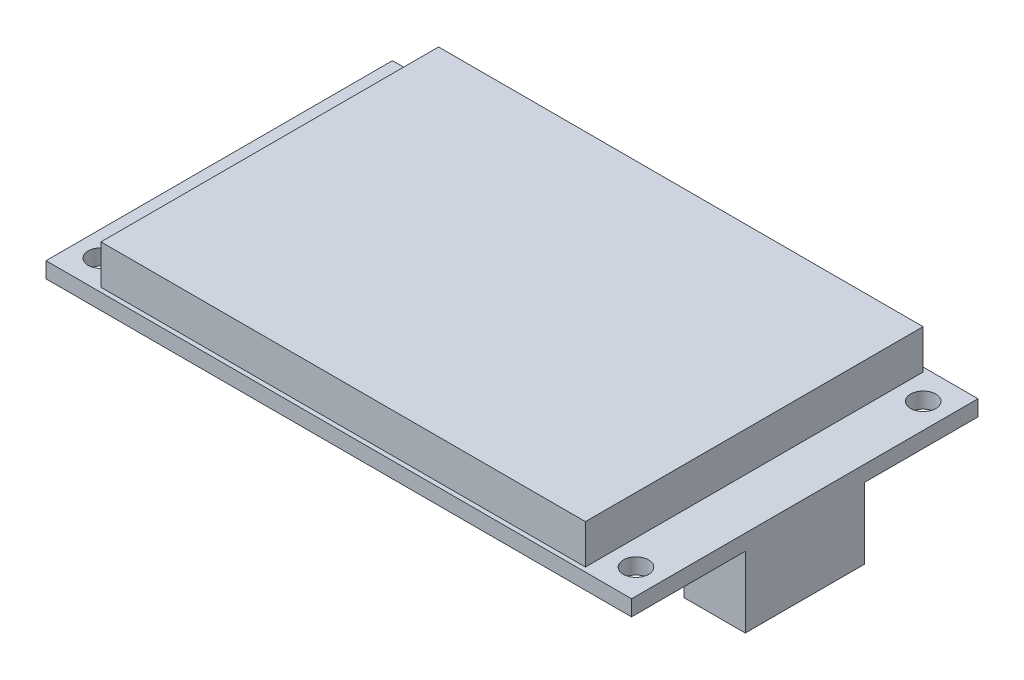
ISO-10303-21;
HEADER;
FILE_DESCRIPTION(('STEP AP214'),'2;1');
FILE_NAME('part.step','',(''),(''),'','','');
FILE_SCHEMA(('AUTOMOTIVE_DESIGN { 1 0 10303 214 1 1 1 1 }'));
ENDSEC;
DATA;
#1=APPLICATION_CONTEXT('core data for automotive mechanical design processes');
#2=APPLICATION_PROTOCOL_DEFINITION('international standard','automotive_design',2000,#1);
#3=PRODUCT_CONTEXT('',#1,'mechanical');
#4=PRODUCT('Part','Part','',(#3));
#5=PRODUCT_RELATED_PRODUCT_CATEGORY('part','',(#4));
#6=PRODUCT_DEFINITION_FORMATION('','',#4);
#7=PRODUCT_DEFINITION_CONTEXT('part definition',#1,'design');
#8=PRODUCT_DEFINITION('design','',#6,#7);
#9=PRODUCT_DEFINITION_SHAPE('','',#8);
#10=(LENGTH_UNIT() NAMED_UNIT(*) SI_UNIT(.MILLI.,.METRE.));
#11=(NAMED_UNIT(*) PLANE_ANGLE_UNIT() SI_UNIT($,.RADIAN.));
#12=(NAMED_UNIT(*) SI_UNIT($,.STERADIAN.) SOLID_ANGLE_UNIT());
#13=UNCERTAINTY_MEASURE_WITH_UNIT(LENGTH_MEASURE(1.E-05),#10,'distance_accuracy_value','');
#14=(GEOMETRIC_REPRESENTATION_CONTEXT(3) GLOBAL_UNCERTAINTY_ASSIGNED_CONTEXT((#13)) GLOBAL_UNIT_ASSIGNED_CONTEXT((#10,
#11,#12)) REPRESENTATION_CONTEXT('',''));
#15=CARTESIAN_POINT('',(0.,0.,0.));
#16=DIRECTION('',(0.,0.,1.));
#17=DIRECTION('',(1.,0.,0.));
#18=AXIS2_PLACEMENT_3D('',#15,#16,#17);
#19=CARTESIAN_POINT('',(0.,2.,0.));
#20=DIRECTION('',(0.,-1.,0.));
#21=DIRECTION('',(0.,0.,-1.));
#22=AXIS2_PLACEMENT_3D('',#19,#20,#21);
#23=PLANE('',#22);
#24=CARTESIAN_POINT('',(-34.,2.,18.25));
#25=DIRECTION('',(0.,1.,0.));
#26=DIRECTION('',(0.,0.,-1.));
#27=AXIS2_PLACEMENT_3D('',#24,#25,#26);
#28=CIRCLE('',#27,1.6);
#29=CARTESIAN_POINT('',(-34.,2.,16.65));
#30=VERTEX_POINT('',#29);
#31=EDGE_CURVE('E210',#30,#30,#28,.T.);
#32=ORIENTED_EDGE('',*,*,#31,.F.);
#33=EDGE_LOOP('',(#32));
#34=FACE_BOUND('',#33,.T.);
#35=CARTESIAN_POINT('',(34.,2.,18.25));
#36=DIRECTION('',(0.,1.,0.));
#37=DIRECTION('',(0.,0.,1.));
#38=AXIS2_PLACEMENT_3D('',#35,#36,#37);
#39=CIRCLE('',#38,1.6);
#40=CARTESIAN_POINT('',(34.,2.,19.85));
#41=VERTEX_POINT('',#40);
#42=EDGE_CURVE('E218',#41,#41,#39,.T.);
#43=ORIENTED_EDGE('',*,*,#42,.F.);
#44=EDGE_LOOP('',(#43));
#45=FACE_BOUND('',#44,.T.);
#46=CARTESIAN_POINT('',(34.,2.,-18.25));
#47=DIRECTION('',(0.,1.,0.));
#48=DIRECTION('',(0.,0.,-1.));
#49=AXIS2_PLACEMENT_3D('',#46,#47,#48);
#50=CIRCLE('',#49,1.6);
#51=CARTESIAN_POINT('',(34.,2.,-19.85));
#52=VERTEX_POINT('',#51);
#53=EDGE_CURVE('E226',#52,#52,#50,.T.);
#54=ORIENTED_EDGE('',*,*,#53,.F.);
#55=EDGE_LOOP('',(#54));
#56=FACE_BOUND('',#55,.T.);
#57=CARTESIAN_POINT('',(-34.,2.,-18.25));
#58=DIRECTION('',(0.,1.,0.));
#59=DIRECTION('',(0.,0.,1.));
#60=AXIS2_PLACEMENT_3D('',#57,#58,#59);
#61=CIRCLE('',#60,1.6);
#62=CARTESIAN_POINT('',(-34.,2.,-16.65));
#63=VERTEX_POINT('',#62);
#64=EDGE_CURVE('E234',#63,#63,#61,.T.);
#65=ORIENTED_EDGE('',*,*,#64,.F.);
#66=EDGE_LOOP('',(#65));
#67=FACE_BOUND('',#66,.T.);
#68=DIRECTION('',(0.,0.,-1.));
#69=VECTOR('',#68,1.);
#70=CARTESIAN_POINT('',(37.2,2.,22.01));
#71=LINE('',#70,#69);
#72=CARTESIAN_POINT('',(37.2,2.,22.01));
#73=VERTEX_POINT('',#72);
#74=CARTESIAN_POINT('',(37.2,2.,-22.01));
#75=VERTEX_POINT('',#74);
#76=EDGE_CURVE('E241',#73,#75,#71,.T.);
#77=ORIENTED_EDGE('',*,*,#76,.T.);
#78=DIRECTION('',(-1.,0.,0.));
#79=VECTOR('',#78,1.);
#80=CARTESIAN_POINT('',(-37.2,2.,-22.01));
#81=LINE('',#80,#79);
#82=CARTESIAN_POINT('',(-37.2,2.,-22.01));
#83=VERTEX_POINT('',#82);
#84=EDGE_CURVE('E245',#75,#83,#81,.T.);
#85=ORIENTED_EDGE('',*,*,#84,.T.);
#86=DIRECTION('',(0.,0.,1.));
#87=VECTOR('',#86,1.);
#88=CARTESIAN_POINT('',(-37.2,2.,22.01));
#89=LINE('',#88,#87);
#90=CARTESIAN_POINT('',(-37.2,2.,22.01));
#91=VERTEX_POINT('',#90);
#92=EDGE_CURVE('E249',#83,#91,#89,.T.);
#93=ORIENTED_EDGE('',*,*,#92,.T.);
#94=DIRECTION('',(1.,0.,0.));
#95=VECTOR('',#94,1.);
#96=CARTESIAN_POINT('',(-37.2,2.,22.01));
#97=LINE('',#96,#95);
#98=EDGE_CURVE('E252',#91,#73,#97,.T.);
#99=ORIENTED_EDGE('',*,*,#98,.T.);
#100=EDGE_LOOP('',(#77,#85,#93,#99));
#101=FACE_BOUND('',#100,.T.);
#102=DIRECTION('',(0.,0.,-1.));
#103=VECTOR('',#102,1.);
#104=CARTESIAN_POINT('',(30.78,2.,21.45));
#105=LINE('',#104,#103);
#106=CARTESIAN_POINT('',(30.78,2.,21.45));
#107=VERTEX_POINT('',#106);
#108=CARTESIAN_POINT('',(30.78,2.,-21.45));
#109=VERTEX_POINT('',#108);
#110=EDGE_CURVE('E158',#107,#109,#105,.T.);
#111=ORIENTED_EDGE('',*,*,#110,.F.);
#112=DIRECTION('',(1.,0.,0.));
#113=VECTOR('',#112,1.);
#114=CARTESIAN_POINT('',(-30.78,2.,21.45));
#115=LINE('',#114,#113);
#116=CARTESIAN_POINT('',(-30.78,2.,21.45));
#117=VERTEX_POINT('',#116);
#118=EDGE_CURVE('E174',#117,#107,#115,.T.);
#119=ORIENTED_EDGE('',*,*,#118,.F.);
#120=DIRECTION('',(0.,0.,1.));
#121=VECTOR('',#120,1.);
#122=CARTESIAN_POINT('',(-30.78,2.,21.45));
#123=LINE('',#122,#121);
#124=CARTESIAN_POINT('',(-30.78,2.,-21.45));
#125=VERTEX_POINT('',#124);
#126=EDGE_CURVE('E187',#125,#117,#123,.T.);
#127=ORIENTED_EDGE('',*,*,#126,.F.);
#128=DIRECTION('',(-1.,0.,0.));
#129=VECTOR('',#128,1.);
#130=CARTESIAN_POINT('',(-30.78,2.,-21.45));
#131=LINE('',#130,#129);
#132=EDGE_CURVE('E163',#109,#125,#131,.T.);
#133=ORIENTED_EDGE('',*,*,#132,.F.);
#134=EDGE_LOOP('',(#111,#119,#127,#133));
#135=FACE_BOUND('',#134,.T.);
#136=ADVANCED_FACE('F42',(#34,#45,#56,#67,#101,#135),#23,.F.);
#137=CARTESIAN_POINT('',(0.,0.,0.));
#138=DIRECTION('',(0.,-1.,0.));
#139=DIRECTION('',(0.,0.,-1.));
#140=AXIS2_PLACEMENT_3D('',#137,#138,#139);
#141=PLANE('',#140);
#142=DIRECTION('',(1.,0.,0.));
#143=VECTOR('',#142,1.);
#144=CARTESIAN_POINT('',(29.4,0.,-7.56));
#145=LINE('',#144,#143);
#146=CARTESIAN_POINT('',(29.4,0.,-7.56));
#147=VERTEX_POINT('',#146);
#148=CARTESIAN_POINT('',(37.2,0.,-7.56));
#149=VERTEX_POINT('',#148);
#150=EDGE_CURVE('E58',#147,#149,#145,.T.);
#151=ORIENTED_EDGE('',*,*,#150,.F.);
#152=DIRECTION('',(0.,0.,-1.));
#153=VECTOR('',#152,1.);
#154=CARTESIAN_POINT('',(29.4,0.,-7.56));
#155=LINE('',#154,#153);
#156=CARTESIAN_POINT('',(29.4,0.,7.56));
#157=VERTEX_POINT('',#156);
#158=EDGE_CURVE('E521',#157,#147,#155,.T.);
#159=ORIENTED_EDGE('',*,*,#158,.F.);
#160=DIRECTION('',(-1.,0.,0.));
#161=VECTOR('',#160,1.);
#162=CARTESIAN_POINT('',(29.4,0.,7.56));
#163=LINE('',#162,#161);
#164=CARTESIAN_POINT('',(37.2,0.,7.56));
#165=VERTEX_POINT('',#164);
#166=EDGE_CURVE('E531',#165,#157,#163,.T.);
#167=ORIENTED_EDGE('',*,*,#166,.F.);
#168=DIRECTION('',(0.,0.,-1.));
#169=VECTOR('',#168,1.);
#170=CARTESIAN_POINT('',(37.2,0.,22.01));
#171=LINE('',#170,#169);
#172=CARTESIAN_POINT('',(37.2,0.,22.01));
#173=VERTEX_POINT('',#172);
#174=EDGE_CURVE('E156',#173,#165,#171,.T.);
#175=ORIENTED_EDGE('',*,*,#174,.F.);
#176=DIRECTION('',(1.,0.,0.));
#177=VECTOR('',#176,1.);
#178=CARTESIAN_POINT('',(-37.2,0.,22.01));
#179=LINE('',#178,#177);
#180=CARTESIAN_POINT('',(-37.2,0.,22.01));
#181=VERTEX_POINT('',#180);
#182=EDGE_CURVE('E246',#181,#173,#179,.T.);
#183=ORIENTED_EDGE('',*,*,#182,.F.);
#184=DIRECTION('',(0.,0.,1.));
#185=VECTOR('',#184,1.);
#186=CARTESIAN_POINT('',(-37.2,0.,22.01));
#187=LINE('',#186,#185);
#188=CARTESIAN_POINT('',(-37.2,0.,-22.01));
#189=VERTEX_POINT('',#188);
#190=EDGE_CURVE('E261',#189,#181,#187,.T.);
#191=ORIENTED_EDGE('',*,*,#190,.F.);
#192=DIRECTION('',(-1.,0.,0.));
#193=VECTOR('',#192,1.);
#194=CARTESIAN_POINT('',(-37.2,0.,-22.01));
#195=LINE('',#194,#193);
#196=CARTESIAN_POINT('',(37.2,0.,-22.01));
#197=VERTEX_POINT('',#196);
#198=EDGE_CURVE('E258',#197,#189,#195,.T.);
#199=ORIENTED_EDGE('',*,*,#198,.F.);
#200=EDGE_CURVE('E63',#149,#197,#171,.T.);
#201=ORIENTED_EDGE('',*,*,#200,.F.);
#202=EDGE_LOOP('',(#151,#159,#167,#175,#183,#191,#199,#201));
#203=FACE_BOUND('',#202,.T.);
#204=CARTESIAN_POINT('',(34.,0.,18.25));
#205=DIRECTION('',(0.,1.,0.));
#206=DIRECTION('',(0.,0.,1.));
#207=AXIS2_PLACEMENT_3D('',#204,#205,#206);
#208=CIRCLE('',#207,1.6);
#209=CARTESIAN_POINT('',(34.,0.,19.85));
#210=VERTEX_POINT('',#209);
#211=EDGE_CURVE('E214',#210,#210,#208,.T.);
#212=ORIENTED_EDGE('',*,*,#211,.T.);
#213=EDGE_LOOP('',(#212));
#214=FACE_BOUND('',#213,.T.);
#215=CARTESIAN_POINT('',(-34.,0.,-18.25));
#216=DIRECTION('',(0.,1.,0.));
#217=DIRECTION('',(0.,0.,1.));
#218=AXIS2_PLACEMENT_3D('',#215,#216,#217);
#219=CIRCLE('',#218,1.6);
#220=CARTESIAN_POINT('',(-34.,0.,-16.65));
#221=VERTEX_POINT('',#220);
#222=EDGE_CURVE('E230',#221,#221,#219,.T.);
#223=ORIENTED_EDGE('',*,*,#222,.T.);
#224=EDGE_LOOP('',(#223));
#225=FACE_BOUND('',#224,.T.);
#226=CARTESIAN_POINT('',(34.,0.,-18.25));
#227=DIRECTION('',(0.,1.,0.));
#228=DIRECTION('',(0.,0.,-1.));
#229=AXIS2_PLACEMENT_3D('',#226,#227,#228);
#230=CIRCLE('',#229,1.6);
#231=CARTESIAN_POINT('',(34.,0.,-19.85));
#232=VERTEX_POINT('',#231);
#233=EDGE_CURVE('E222',#232,#232,#230,.T.);
#234=ORIENTED_EDGE('',*,*,#233,.T.);
#235=EDGE_LOOP('',(#234));
#236=FACE_BOUND('',#235,.T.);
#237=CARTESIAN_POINT('',(-34.,0.,18.25));
#238=DIRECTION('',(0.,1.,0.));
#239=DIRECTION('',(0.,0.,-1.));
#240=AXIS2_PLACEMENT_3D('',#237,#238,#239);
#241=CIRCLE('',#240,1.6);
#242=CARTESIAN_POINT('',(-34.,0.,16.65));
#243=VERTEX_POINT('',#242);
#244=EDGE_CURVE('E209',#243,#243,#241,.T.);
#245=ORIENTED_EDGE('',*,*,#244,.T.);
#246=EDGE_LOOP('',(#245));
#247=FACE_BOUND('',#246,.T.);
#248=ADVANCED_FACE('F281',(#203,#214,#225,#236,#247),#141,.T.);
#249=CARTESIAN_POINT('',(37.2,2.,22.01));
#250=DIRECTION('',(-1.,0.,0.));
#251=DIRECTION('',(0.,0.,1.));
#252=AXIS2_PLACEMENT_3D('',#249,#250,#251);
#253=PLANE('',#252);
#254=ORIENTED_EDGE('',*,*,#174,.T.);
#255=DIRECTION('',(0.,1.,0.));
#256=VECTOR('',#255,1.);
#257=CARTESIAN_POINT('',(37.2,-9.,7.56));
#258=LINE('',#257,#256);
#259=CARTESIAN_POINT('',(37.2,-9.,7.56));
#260=VERTEX_POINT('',#259);
#261=EDGE_CURVE('E135',#260,#165,#258,.T.);
#262=ORIENTED_EDGE('',*,*,#261,.F.);
#263=DIRECTION('',(0.,0.,1.));
#264=VECTOR('',#263,1.);
#265=CARTESIAN_POINT('',(37.2,-9.,-7.56));
#266=LINE('',#265,#264);
#267=CARTESIAN_POINT('',(37.2,-9.,-7.56));
#268=VERTEX_POINT('',#267);
#269=EDGE_CURVE('E142',#268,#260,#266,.T.);
#270=ORIENTED_EDGE('',*,*,#269,.F.);
#271=DIRECTION('',(0.,1.,0.));
#272=VECTOR('',#271,1.);
#273=CARTESIAN_POINT('',(37.2,-9.,-7.56));
#274=LINE('',#273,#272);
#275=EDGE_CURVE('E518',#268,#149,#274,.T.);
#276=ORIENTED_EDGE('',*,*,#275,.T.);
#277=ORIENTED_EDGE('',*,*,#200,.T.);
#278=DIRECTION('',(0.,-1.,0.));
#279=VECTOR('',#278,1.);
#280=CARTESIAN_POINT('',(37.2,2.,-22.01));
#281=LINE('',#280,#279);
#282=EDGE_CURVE('E11',#75,#197,#281,.T.);
#283=ORIENTED_EDGE('',*,*,#282,.F.);
#284=ORIENTED_EDGE('',*,*,#76,.F.);
#285=DIRECTION('',(0.,-1.,0.));
#286=VECTOR('',#285,1.);
#287=CARTESIAN_POINT('',(37.2,2.,22.01));
#288=LINE('',#287,#286);
#289=EDGE_CURVE('E255',#73,#173,#288,.T.);
#290=ORIENTED_EDGE('',*,*,#289,.T.);
#291=EDGE_LOOP('',(#254,#262,#270,#276,#277,#283,#284,#290));
#292=FACE_BOUND('',#291,.T.);
#293=ADVANCED_FACE('F44',(#292),#253,.F.);
#294=CARTESIAN_POINT('',(-37.2,2.,-22.01));
#295=DIRECTION('',(0.,0.,1.));
#296=DIRECTION('',(1.,0.,0.));
#297=AXIS2_PLACEMENT_3D('',#294,#295,#296);
#298=PLANE('',#297);
#299=ORIENTED_EDGE('',*,*,#198,.T.);
#300=DIRECTION('',(0.,-1.,0.));
#301=VECTOR('',#300,1.);
#302=CARTESIAN_POINT('',(-37.2,2.,-22.01));
#303=LINE('',#302,#301);
#304=EDGE_CURVE('E51',#83,#189,#303,.T.);
#305=ORIENTED_EDGE('',*,*,#304,.F.);
#306=ORIENTED_EDGE('',*,*,#84,.F.);
#307=ORIENTED_EDGE('',*,*,#282,.T.);
#308=EDGE_LOOP('',(#299,#305,#306,#307));
#309=FACE_BOUND('',#308,.T.);
#310=ADVANCED_FACE('F291',(#309),#298,.F.);
#311=CARTESIAN_POINT('',(-37.2,2.,22.01));
#312=DIRECTION('',(1.,0.,0.));
#313=DIRECTION('',(0.,0.,-1.));
#314=AXIS2_PLACEMENT_3D('',#311,#312,#313);
#315=PLANE('',#314);
#316=ORIENTED_EDGE('',*,*,#190,.T.);
#317=DIRECTION('',(0.,-1.,0.));
#318=VECTOR('',#317,1.);
#319=CARTESIAN_POINT('',(-37.2,2.,22.01));
#320=LINE('',#319,#318);
#321=EDGE_CURVE('E268',#91,#181,#320,.T.);
#322=ORIENTED_EDGE('',*,*,#321,.F.);
#323=ORIENTED_EDGE('',*,*,#92,.F.);
#324=ORIENTED_EDGE('',*,*,#304,.T.);
#325=EDGE_LOOP('',(#316,#322,#323,#324));
#326=FACE_BOUND('',#325,.T.);
#327=ADVANCED_FACE('F277',(#326),#315,.F.);
#328=CARTESIAN_POINT('',(-37.2,2.,22.01));
#329=DIRECTION('',(0.,0.,-1.));
#330=DIRECTION('',(-1.,0.,0.));
#331=AXIS2_PLACEMENT_3D('',#328,#329,#330);
#332=PLANE('',#331);
#333=ORIENTED_EDGE('',*,*,#182,.T.);
#334=ORIENTED_EDGE('',*,*,#289,.F.);
#335=ORIENTED_EDGE('',*,*,#98,.F.);
#336=ORIENTED_EDGE('',*,*,#321,.T.);
#337=EDGE_LOOP('',(#333,#334,#335,#336));
#338=FACE_BOUND('',#337,.T.);
#339=ADVANCED_FACE('F285',(#338),#332,.F.);
#340=CARTESIAN_POINT('',(-34.,2.,-18.25));
#341=DIRECTION('',(0.,-1.,0.));
#342=DIRECTION('',(0.,0.,-1.));
#343=AXIS2_PLACEMENT_3D('',#340,#341,#342);
#344=CYLINDRICAL_SURFACE('',#343,1.6);
#345=ORIENTED_EDGE('',*,*,#64,.T.);
#346=EDGE_LOOP('',(#345));
#347=FACE_BOUND('',#346,.T.);
#348=ORIENTED_EDGE('',*,*,#222,.F.);
#349=EDGE_LOOP('',(#348));
#350=FACE_BOUND('',#349,.T.);
#351=ADVANCED_FACE('F308',(#347,#350),#344,.F.);
#352=CARTESIAN_POINT('',(34.,2.,-18.25));
#353=DIRECTION('',(0.,-1.,0.));
#354=DIRECTION('',(0.,0.,-1.));
#355=AXIS2_PLACEMENT_3D('',#352,#353,#354);
#356=CYLINDRICAL_SURFACE('',#355,1.6);
#357=ORIENTED_EDGE('',*,*,#53,.T.);
#358=EDGE_LOOP('',(#357));
#359=FACE_BOUND('',#358,.T.);
#360=ORIENTED_EDGE('',*,*,#233,.F.);
#361=EDGE_LOOP('',(#360));
#362=FACE_BOUND('',#361,.T.);
#363=ADVANCED_FACE('F315',(#359,#362),#356,.F.);
#364=CARTESIAN_POINT('',(34.,2.,18.25));
#365=DIRECTION('',(0.,-1.,0.));
#366=DIRECTION('',(0.,0.,-1.));
#367=AXIS2_PLACEMENT_3D('',#364,#365,#366);
#368=CYLINDRICAL_SURFACE('',#367,1.6);
#369=ORIENTED_EDGE('',*,*,#42,.T.);
#370=EDGE_LOOP('',(#369));
#371=FACE_BOUND('',#370,.T.);
#372=ORIENTED_EDGE('',*,*,#211,.F.);
#373=EDGE_LOOP('',(#372));
#374=FACE_BOUND('',#373,.T.);
#375=ADVANCED_FACE('F320',(#371,#374),#368,.F.);
#376=CARTESIAN_POINT('',(-34.,2.,18.25));
#377=DIRECTION('',(0.,-1.,0.));
#378=DIRECTION('',(0.,0.,-1.));
#379=AXIS2_PLACEMENT_3D('',#376,#377,#378);
#380=CYLINDRICAL_SURFACE('',#379,1.6);
#381=ORIENTED_EDGE('',*,*,#31,.T.);
#382=EDGE_LOOP('',(#381));
#383=FACE_BOUND('',#382,.T.);
#384=ORIENTED_EDGE('',*,*,#244,.F.);
#385=EDGE_LOOP('',(#384));
#386=FACE_BOUND('',#385,.T.);
#387=ADVANCED_FACE('F331',(#383,#386),#380,.F.);
#388=CARTESIAN_POINT('',(30.78,7.,21.45));
#389=DIRECTION('',(-1.,0.,0.));
#390=DIRECTION('',(0.,0.,1.));
#391=AXIS2_PLACEMENT_3D('',#388,#389,#390);
#392=PLANE('',#391);
#393=ORIENTED_EDGE('',*,*,#110,.T.);
#394=DIRECTION('',(0.,-1.,0.));
#395=VECTOR('',#394,1.);
#396=CARTESIAN_POINT('',(30.78,7.,-21.45));
#397=LINE('',#396,#395);
#398=CARTESIAN_POINT('',(30.78,7.,-21.45));
#399=VERTEX_POINT('',#398);
#400=EDGE_CURVE('E205',#399,#109,#397,.T.);
#401=ORIENTED_EDGE('',*,*,#400,.F.);
#402=DIRECTION('',(0.,0.,-1.));
#403=VECTOR('',#402,1.);
#404=CARTESIAN_POINT('',(30.78,7.,21.45));
#405=LINE('',#404,#403);
#406=CARTESIAN_POINT('',(30.78,7.,21.45));
#407=VERTEX_POINT('',#406);
#408=EDGE_CURVE('E169',#407,#399,#405,.T.);
#409=ORIENTED_EDGE('',*,*,#408,.F.);
#410=DIRECTION('',(0.,-1.,0.));
#411=VECTOR('',#410,1.);
#412=CARTESIAN_POINT('',(30.78,7.,21.45));
#413=LINE('',#412,#411);
#414=EDGE_CURVE('E182',#407,#107,#413,.T.);
#415=ORIENTED_EDGE('',*,*,#414,.T.);
#416=EDGE_LOOP('',(#393,#401,#409,#415));
#417=FACE_BOUND('',#416,.T.);
#418=ADVANCED_FACE('F333',(#417),#392,.F.);
#419=CARTESIAN_POINT('',(-30.78,7.,-21.45));
#420=DIRECTION('',(0.,0.,1.));
#421=DIRECTION('',(1.,0.,0.));
#422=AXIS2_PLACEMENT_3D('',#419,#420,#421);
#423=PLANE('',#422);
#424=ORIENTED_EDGE('',*,*,#132,.T.);
#425=DIRECTION('',(0.,-1.,0.));
#426=VECTOR('',#425,1.);
#427=CARTESIAN_POINT('',(-30.78,7.,-21.45));
#428=LINE('',#427,#426);
#429=CARTESIAN_POINT('',(-30.78,7.,-21.45));
#430=VERTEX_POINT('',#429);
#431=EDGE_CURVE('E201',#430,#125,#428,.T.);
#432=ORIENTED_EDGE('',*,*,#431,.F.);
#433=DIRECTION('',(-1.,0.,0.));
#434=VECTOR('',#433,1.);
#435=CARTESIAN_POINT('',(-30.78,7.,-21.45));
#436=LINE('',#435,#434);
#437=EDGE_CURVE('E173',#399,#430,#436,.T.);
#438=ORIENTED_EDGE('',*,*,#437,.F.);
#439=ORIENTED_EDGE('',*,*,#400,.T.);
#440=EDGE_LOOP('',(#424,#432,#438,#439));
#441=FACE_BOUND('',#440,.T.);
#442=ADVANCED_FACE('F340',(#441),#423,.F.);
#443=CARTESIAN_POINT('',(-30.78,7.,21.45));
#444=DIRECTION('',(1.,0.,0.));
#445=DIRECTION('',(0.,0.,-1.));
#446=AXIS2_PLACEMENT_3D('',#443,#444,#445);
#447=PLANE('',#446);
#448=ORIENTED_EDGE('',*,*,#126,.T.);
#449=DIRECTION('',(0.,-1.,0.));
#450=VECTOR('',#449,1.);
#451=CARTESIAN_POINT('',(-30.78,7.,21.45));
#452=LINE('',#451,#450);
#453=CARTESIAN_POINT('',(-30.78,7.,21.45));
#454=VERTEX_POINT('',#453);
#455=EDGE_CURVE('E197',#454,#117,#452,.T.);
#456=ORIENTED_EDGE('',*,*,#455,.F.);
#457=DIRECTION('',(0.,0.,1.));
#458=VECTOR('',#457,1.);
#459=CARTESIAN_POINT('',(-30.78,7.,21.45));
#460=LINE('',#459,#458);
#461=EDGE_CURVE('E177',#430,#454,#460,.T.);
#462=ORIENTED_EDGE('',*,*,#461,.F.);
#463=ORIENTED_EDGE('',*,*,#431,.T.);
#464=EDGE_LOOP('',(#448,#456,#462,#463));
#465=FACE_BOUND('',#464,.T.);
#466=ADVANCED_FACE('F348',(#465),#447,.F.);
#467=CARTESIAN_POINT('',(-30.78,7.,21.45));
#468=DIRECTION('',(0.,0.,-1.));
#469=DIRECTION('',(-1.,0.,0.));
#470=AXIS2_PLACEMENT_3D('',#467,#468,#469);
#471=PLANE('',#470);
#472=ORIENTED_EDGE('',*,*,#118,.T.);
#473=ORIENTED_EDGE('',*,*,#414,.F.);
#474=DIRECTION('',(1.,0.,0.));
#475=VECTOR('',#474,1.);
#476=CARTESIAN_POINT('',(-30.78,7.,21.45));
#477=LINE('',#476,#475);
#478=EDGE_CURVE('E180',#454,#407,#477,.T.);
#479=ORIENTED_EDGE('',*,*,#478,.F.);
#480=ORIENTED_EDGE('',*,*,#455,.T.);
#481=EDGE_LOOP('',(#472,#473,#479,#480));
#482=FACE_BOUND('',#481,.T.);
#483=ADVANCED_FACE('F352',(#482),#471,.F.);
#484=CARTESIAN_POINT('',(0.,7.,0.));
#485=DIRECTION('',(0.,-1.,0.));
#486=DIRECTION('',(0.,0.,-1.));
#487=AXIS2_PLACEMENT_3D('',#484,#485,#486);
#488=PLANE('',#487);
#489=ORIENTED_EDGE('',*,*,#408,.T.);
#490=ORIENTED_EDGE('',*,*,#437,.T.);
#491=ORIENTED_EDGE('',*,*,#461,.T.);
#492=ORIENTED_EDGE('',*,*,#478,.T.);
#493=EDGE_LOOP('',(#489,#490,#491,#492));
#494=FACE_BOUND('',#493,.T.);
#495=ADVANCED_FACE('F356',(#494),#488,.F.);
#496=CARTESIAN_POINT('',(29.4,-9.,7.56));
#497=DIRECTION('',(0.,0.,-1.));
#498=DIRECTION('',(-1.,0.,0.));
#499=AXIS2_PLACEMENT_3D('',#496,#497,#498);
#500=PLANE('',#499);
#501=ORIENTED_EDGE('',*,*,#166,.T.);
#502=DIRECTION('',(0.,1.,0.));
#503=VECTOR('',#502,1.);
#504=CARTESIAN_POINT('',(29.4,-9.,7.56));
#505=LINE('',#504,#503);
#506=CARTESIAN_POINT('',(29.4,-9.,7.56));
#507=VERTEX_POINT('',#506);
#508=EDGE_CURVE('E137',#507,#157,#505,.T.);
#509=ORIENTED_EDGE('',*,*,#508,.F.);
#510=DIRECTION('',(-1.,0.,0.));
#511=VECTOR('',#510,1.);
#512=CARTESIAN_POINT('',(29.4,-9.,7.56));
#513=LINE('',#512,#511);
#514=EDGE_CURVE('E130',#260,#507,#513,.T.);
#515=ORIENTED_EDGE('',*,*,#514,.F.);
#516=ORIENTED_EDGE('',*,*,#261,.T.);
#517=EDGE_LOOP('',(#501,#509,#515,#516));
#518=FACE_BOUND('',#517,.T.);
#519=ADVANCED_FACE('F133',(#518),#500,.F.);
#520=CARTESIAN_POINT('',(29.4,-9.,-7.56));
#521=DIRECTION('',(1.,0.,0.));
#522=DIRECTION('',(0.,0.,-1.));
#523=AXIS2_PLACEMENT_3D('',#520,#521,#522);
#524=PLANE('',#523);
#525=ORIENTED_EDGE('',*,*,#158,.T.);
#526=DIRECTION('',(0.,1.,0.));
#527=VECTOR('',#526,1.);
#528=CARTESIAN_POINT('',(29.4,-9.,-7.56));
#529=LINE('',#528,#527);
#530=CARTESIAN_POINT('',(29.4,-9.,-7.56));
#531=VERTEX_POINT('',#530);
#532=EDGE_CURVE('E165',#531,#147,#529,.T.);
#533=ORIENTED_EDGE('',*,*,#532,.F.);
#534=DIRECTION('',(0.,0.,-1.));
#535=VECTOR('',#534,1.);
#536=CARTESIAN_POINT('',(29.4,-9.,-7.56));
#537=LINE('',#536,#535);
#538=EDGE_CURVE('E141',#507,#531,#537,.T.);
#539=ORIENTED_EDGE('',*,*,#538,.F.);
#540=ORIENTED_EDGE('',*,*,#508,.T.);
#541=EDGE_LOOP('',(#525,#533,#539,#540));
#542=FACE_BOUND('',#541,.T.);
#543=ADVANCED_FACE('F363',(#542),#524,.F.);
#544=CARTESIAN_POINT('',(29.4,-9.,-7.56));
#545=DIRECTION('',(0.,0.,1.));
#546=DIRECTION('',(1.,0.,0.));
#547=AXIS2_PLACEMENT_3D('',#544,#545,#546);
#548=PLANE('',#547);
#549=ORIENTED_EDGE('',*,*,#150,.T.);
#550=ORIENTED_EDGE('',*,*,#275,.F.);
#551=DIRECTION('',(1.,0.,0.));
#552=VECTOR('',#551,1.);
#553=CARTESIAN_POINT('',(29.4,-9.,-7.56));
#554=LINE('',#553,#552);
#555=EDGE_CURVE('E147',#531,#268,#554,.T.);
#556=ORIENTED_EDGE('',*,*,#555,.F.);
#557=ORIENTED_EDGE('',*,*,#532,.T.);
#558=EDGE_LOOP('',(#549,#550,#556,#557));
#559=FACE_BOUND('',#558,.T.);
#560=ADVANCED_FACE('F366',(#559),#548,.F.);
#561=CARTESIAN_POINT('',(0.,-9.,0.));
#562=DIRECTION('',(0.,1.,0.));
#563=DIRECTION('',(0.,0.,1.));
#564=AXIS2_PLACEMENT_3D('',#561,#562,#563);
#565=PLANE('',#564);
#566=ORIENTED_EDGE('',*,*,#269,.T.);
#567=ORIENTED_EDGE('',*,*,#514,.T.);
#568=ORIENTED_EDGE('',*,*,#538,.T.);
#569=ORIENTED_EDGE('',*,*,#555,.T.);
#570=EDGE_LOOP('',(#566,#567,#568,#569));
#571=FACE_BOUND('',#570,.T.);
#572=ADVANCED_FACE('F145',(#571),#565,.F.);
#573=CLOSED_SHELL('',(#136,#248,#293,#310,#327,#339,#351,#363,#375,#387,#418,#442,#466,#483,
#495,#519,#543,#560,#572));
#574=MANIFOLD_SOLID_BREP('B2',#573);
#575=ADVANCED_BREP_SHAPE_REPRESENTATION('',(#18,#574),#14);
#576=SHAPE_DEFINITION_REPRESENTATION(#9,#575);
ENDSEC;
END-ISO-10303-21;
